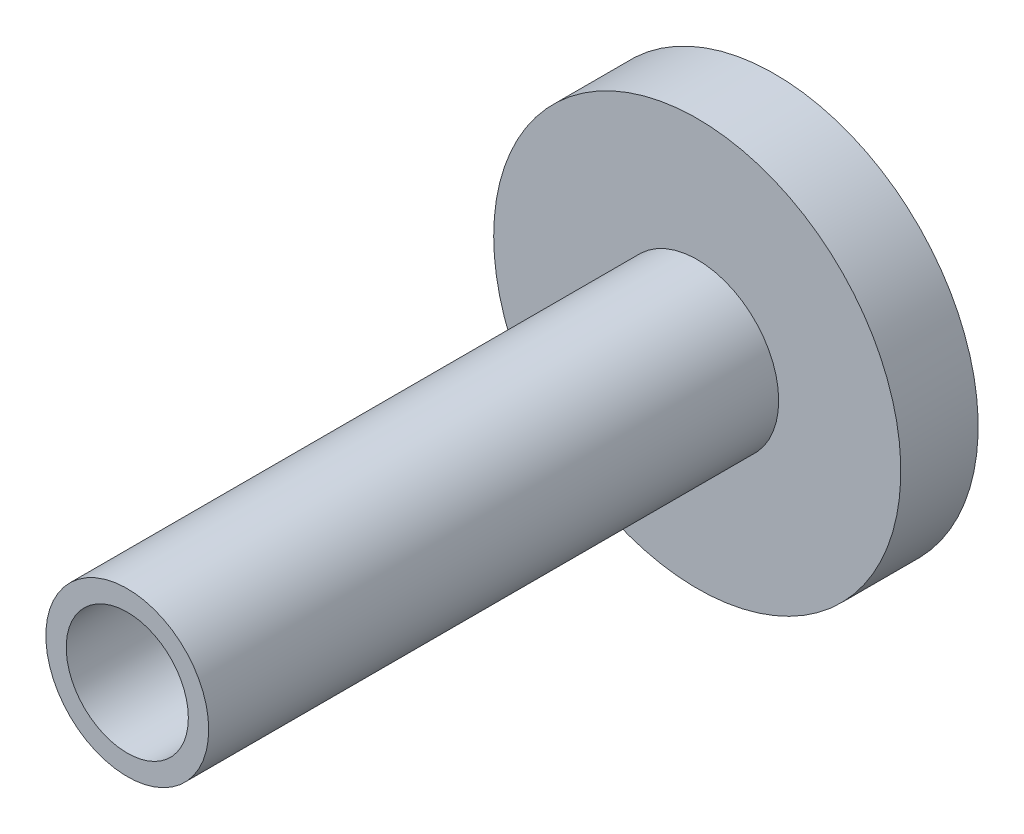
ISO-10303-21;
HEADER;
FILE_DESCRIPTION(('STEP AP214'),'2;1');
FILE_NAME('part.step','',(''),(''),'','','');
FILE_SCHEMA(('AUTOMOTIVE_DESIGN { 1 0 10303 214 1 1 1 1 }'));
ENDSEC;
DATA;
#1=APPLICATION_CONTEXT('core data for automotive mechanical design processes');
#2=APPLICATION_PROTOCOL_DEFINITION('international standard','automotive_design',2000,#1);
#3=PRODUCT_CONTEXT('',#1,'mechanical');
#4=PRODUCT('Part','Part','',(#3));
#5=PRODUCT_RELATED_PRODUCT_CATEGORY('part','',(#4));
#6=PRODUCT_DEFINITION_FORMATION('','',#4);
#7=PRODUCT_DEFINITION_CONTEXT('part definition',#1,'design');
#8=PRODUCT_DEFINITION('design','',#6,#7);
#9=PRODUCT_DEFINITION_SHAPE('','',#8);
#10=(LENGTH_UNIT() NAMED_UNIT(*) SI_UNIT(.MILLI.,.METRE.));
#11=(NAMED_UNIT(*) PLANE_ANGLE_UNIT() SI_UNIT($,.RADIAN.));
#12=(NAMED_UNIT(*) SI_UNIT($,.STERADIAN.) SOLID_ANGLE_UNIT());
#13=UNCERTAINTY_MEASURE_WITH_UNIT(LENGTH_MEASURE(1.E-05),#10,'distance_accuracy_value','');
#14=(GEOMETRIC_REPRESENTATION_CONTEXT(3) GLOBAL_UNCERTAINTY_ASSIGNED_CONTEXT((#13)) GLOBAL_UNIT_ASSIGNED_CONTEXT((#10,
#11,#12)) REPRESENTATION_CONTEXT('',''));
#15=CARTESIAN_POINT('',(0.,0.,0.));
#16=DIRECTION('',(0.,0.,1.));
#17=DIRECTION('',(1.,0.,0.));
#18=AXIS2_PLACEMENT_3D('',#15,#16,#17);
#19=CARTESIAN_POINT('',(0.,0.,1.9));
#20=DIRECTION('',(0.,0.,-1.));
#21=DIRECTION('',(-1.,0.,0.));
#22=AXIS2_PLACEMENT_3D('',#19,#20,#21);
#23=CYLINDRICAL_SURFACE('',#22,5.);
#24=CARTESIAN_POINT('',(0.,0.,1.9));
#25=DIRECTION('',(0.,0.,1.));
#26=DIRECTION('',(1.,0.,0.));
#27=AXIS2_PLACEMENT_3D('',#24,#25,#26);
#28=CIRCLE('',#27,5.);
#29=CARTESIAN_POINT('',(-5.,0.,1.9));
#30=VERTEX_POINT('',#29);
#31=EDGE_CURVE('E10',#30,#30,#28,.T.);
#32=CARTESIAN_POINT('',(0.,0.,0.));
#33=DIRECTION('',(0.,0.,1.));
#34=DIRECTION('',(1.,0.,0.));
#35=AXIS2_PLACEMENT_3D('',#32,#33,#34);
#36=CIRCLE('',#35,5.);
#37=CARTESIAN_POINT('',(-5.,0.,0.));
#38=VERTEX_POINT('',#37);
#39=EDGE_CURVE('E37',#38,#38,#36,.T.);
#40=CARTESIAN_POINT('',(-5.,0.,1.9));
#41=CARTESIAN_POINT('',(-5.,0.,1.88020833333333));
#42=CARTESIAN_POINT('',(-5.,0.,1.86041666666667));
#43=CARTESIAN_POINT('',(-5.,0.,1.82083333333333));
#44=CARTESIAN_POINT('',(-5.,0.,1.80104166666667));
#45=CARTESIAN_POINT('',(-5.,0.,1.76145833333333));
#46=CARTESIAN_POINT('',(-5.,0.,1.74166666666667));
#47=CARTESIAN_POINT('',(-5.,0.,1.70208333333333));
#48=CARTESIAN_POINT('',(-5.,0.,1.68229166666667));
#49=CARTESIAN_POINT('',(-5.,0.,1.64270833333333));
#50=CARTESIAN_POINT('',(-5.,0.,1.62291666666667));
#51=CARTESIAN_POINT('',(-5.,0.,1.58333333333333));
#52=CARTESIAN_POINT('',(-5.,0.,1.56354166666667));
#53=CARTESIAN_POINT('',(-5.,0.,1.52395833333333));
#54=CARTESIAN_POINT('',(-5.,0.,1.50416666666667));
#55=CARTESIAN_POINT('',(-5.,0.,1.46458333333333));
#56=CARTESIAN_POINT('',(-5.,0.,1.44479166666667));
#57=CARTESIAN_POINT('',(-5.,0.,1.40520833333333));
#58=CARTESIAN_POINT('',(-5.,0.,1.38541666666667));
#59=CARTESIAN_POINT('',(-5.,0.,1.34583333333333));
#60=CARTESIAN_POINT('',(-5.,0.,1.32604166666667));
#61=CARTESIAN_POINT('',(-5.,0.,1.28645833333333));
#62=CARTESIAN_POINT('',(-5.,0.,1.26666666666667));
#63=CARTESIAN_POINT('',(-5.,0.,1.22708333333333));
#64=CARTESIAN_POINT('',(-5.,0.,1.20729166666667));
#65=CARTESIAN_POINT('',(-5.,0.,1.16770833333333));
#66=CARTESIAN_POINT('',(-5.,0.,1.14791666666667));
#67=CARTESIAN_POINT('',(-5.,0.,1.10833333333333));
#68=CARTESIAN_POINT('',(-5.,0.,1.08854166666667));
#69=CARTESIAN_POINT('',(-5.,0.,1.04895833333333));
#70=CARTESIAN_POINT('',(-5.,0.,1.02916666666667));
#71=CARTESIAN_POINT('',(-5.,0.,0.989583333333333));
#72=CARTESIAN_POINT('',(-5.,0.,0.969791666666666));
#73=CARTESIAN_POINT('',(-5.,0.,0.930208333333333));
#74=CARTESIAN_POINT('',(-5.,0.,0.910416666666667));
#75=CARTESIAN_POINT('',(-5.,0.,0.870833333333333));
#76=CARTESIAN_POINT('',(-5.,0.,0.851041666666667));
#77=CARTESIAN_POINT('',(-5.,0.,0.811458333333333));
#78=CARTESIAN_POINT('',(-5.,0.,0.791666666666667));
#79=CARTESIAN_POINT('',(-5.,0.,0.752083333333333));
#80=CARTESIAN_POINT('',(-5.,0.,0.732291666666667));
#81=CARTESIAN_POINT('',(-5.,0.,0.692708333333333));
#82=CARTESIAN_POINT('',(-5.,0.,0.672916666666667));
#83=CARTESIAN_POINT('',(-5.,0.,0.633333333333333));
#84=CARTESIAN_POINT('',(-5.,0.,0.613541666666667));
#85=CARTESIAN_POINT('',(-5.,0.,0.573958333333333));
#86=CARTESIAN_POINT('',(-5.,0.,0.554166666666667));
#87=CARTESIAN_POINT('',(-5.,0.,0.514583333333334));
#88=CARTESIAN_POINT('',(-5.,0.,0.494791666666667));
#89=CARTESIAN_POINT('',(-5.,0.,0.455208333333333));
#90=CARTESIAN_POINT('',(-5.,0.,0.435416666666667));
#91=CARTESIAN_POINT('',(-5.,0.,0.395833333333333));
#92=CARTESIAN_POINT('',(-5.,0.,0.376041666666667));
#93=CARTESIAN_POINT('',(-5.,0.,0.336458333333333));
#94=CARTESIAN_POINT('',(-5.,0.,0.316666666666667));
#95=CARTESIAN_POINT('',(-5.,0.,0.277083333333333));
#96=CARTESIAN_POINT('',(-5.,0.,0.257291666666667));
#97=CARTESIAN_POINT('',(-5.,0.,0.217708333333333));
#98=CARTESIAN_POINT('',(-5.,0.,0.197916666666667));
#99=CARTESIAN_POINT('',(-5.,0.,0.158333333333333));
#100=CARTESIAN_POINT('',(-5.,0.,0.138541666666667));
#101=CARTESIAN_POINT('',(-5.,0.,0.0989583333333333));
#102=CARTESIAN_POINT('',(-5.,0.,0.0791666666666666));
#103=CARTESIAN_POINT('',(-5.,0.,0.0395833333333333));
#104=CARTESIAN_POINT('',(-5.,0.,0.0197916666666666));
#105=CARTESIAN_POINT('',(-5.,0.,0.));
#106=B_SPLINE_CURVE_WITH_KNOTS('',3,(#40,#41,#42,#43,#44,#45,#46,#47,#48,#49,#50,#51,#52,#53,
#54,#55,#56,#57,#58,#59,#60,#61,#62,#63,#64,#65,#66,#67,#68,#69,#70,#71,#72,#73,#74,#75,#76,#77,
#78,#79,#80,#81,#82,#83,#84,#85,#86,#87,#88,#89,#90,#91,#92,#93,#94,#95,#96,#97,#98,#99,#100,
#101,#102,#103,#104,#105),.UNSPECIFIED.,.F.,.F.,(4,2,2,2,2,2,2,2,2,2,2,2,2,2,2,2,2,2,2,2,2,2,2,
2,2,2,2,2,2,2,2,2,4),(0.,0.0593750000000002,0.11875,0.178125,0.2375,0.296875,0.35625,0.415625,
0.475,0.534375,0.59375,0.653125,0.7125,0.771875,0.83125,0.890625,0.95,1.009375,1.06875,1.128125,
1.1875,1.246875,1.30625,1.365625,1.425,1.484375,1.54375,1.603125,1.6625,1.721875,1.78125,
1.840625,1.9),.UNSPECIFIED.);
#107=EDGE_CURVE('BSEAM34',#30,#38,#106,.T.);
#108=ORIENTED_EDGE('',*,*,#31,.F.);
#109=ORIENTED_EDGE('',*,*,#39,.T.);
#110=ORIENTED_EDGE('',*,*,#107,.T.);
#111=ORIENTED_EDGE('',*,*,#107,.F.);
#112=EDGE_LOOP('',(#108,#110,#109,#111));
#113=FACE_BOUND('',#112,.T.);
#114=ADVANCED_FACE('F34',(#113),#23,.T.);
#115=CARTESIAN_POINT('',(0.,0.,1.9));
#116=DIRECTION('',(0.,0.,1.));
#117=DIRECTION('',(1.,0.,0.));
#118=AXIS2_PLACEMENT_3D('',#115,#116,#117);
#119=PLANE('',#118);
#120=CARTESIAN_POINT('',(0.,0.,1.9));
#121=DIRECTION('',(0.,0.,1.));
#122=DIRECTION('',(1.,0.,0.));
#123=AXIS2_PLACEMENT_3D('',#120,#121,#122);
#124=CIRCLE('',#123,2.);
#125=CARTESIAN_POINT('',(2.,0.,1.9));
#126=VERTEX_POINT('',#125);
#127=EDGE_CURVE('E46',#126,#126,#124,.T.);
#128=ORIENTED_EDGE('',*,*,#127,.F.);
#129=EDGE_LOOP('',(#128));
#130=FACE_BOUND('',#129,.T.);
#131=ORIENTED_EDGE('',*,*,#31,.T.);
#132=EDGE_LOOP('',(#131));
#133=FACE_BOUND('',#132,.T.);
#134=ADVANCED_FACE('F79',(#130,#133),#119,.T.);
#135=CARTESIAN_POINT('',(0.,0.,0.));
#136=DIRECTION('',(0.,0.,1.));
#137=DIRECTION('',(1.,0.,0.));
#138=AXIS2_PLACEMENT_3D('',#135,#136,#137);
#139=PLANE('',#138);
#140=ORIENTED_EDGE('',*,*,#39,.F.);
#141=EDGE_LOOP('',(#140));
#142=FACE_BOUND('',#141,.T.);
#143=ADVANCED_FACE('F75',(#142),#139,.F.);
#144=CARTESIAN_POINT('',(0.,0.,15.9));
#145=DIRECTION('',(0.,0.,-1.));
#146=DIRECTION('',(-1.,0.,0.));
#147=AXIS2_PLACEMENT_3D('',#144,#145,#146);
#148=CYLINDRICAL_SURFACE('',#147,2.);
#149=CARTESIAN_POINT('',(0.,0.,15.9));
#150=DIRECTION('',(0.,0.,1.));
#151=DIRECTION('',(1.,0.,0.));
#152=AXIS2_PLACEMENT_3D('',#149,#150,#151);
#153=CIRCLE('',#152,2.);
#154=CARTESIAN_POINT('',(2.,0.,15.9));
#155=VERTEX_POINT('',#154);
#156=EDGE_CURVE('E44',#155,#155,#153,.T.);
#157=ORIENTED_EDGE('',*,*,#156,.F.);
#158=EDGE_LOOP('',(#157));
#159=FACE_BOUND('',#158,.T.);
#160=ORIENTED_EDGE('',*,*,#127,.T.);
#161=EDGE_LOOP('',(#160));
#162=FACE_BOUND('',#161,.T.);
#163=ADVANCED_FACE('F69',(#159,#162),#148,.T.);
#164=CARTESIAN_POINT('',(0.,0.,15.9));
#165=DIRECTION('',(0.,0.,1.));
#166=DIRECTION('',(1.,0.,0.));
#167=AXIS2_PLACEMENT_3D('',#164,#165,#166);
#168=PLANE('',#167);
#169=CARTESIAN_POINT('',(0.,0.,15.9));
#170=DIRECTION('',(0.,0.,1.));
#171=DIRECTION('',(1.,0.,0.));
#172=AXIS2_PLACEMENT_3D('',#169,#170,#171);
#173=CIRCLE('',#172,1.5);
#174=CARTESIAN_POINT('',(1.5,0.,15.9));
#175=VERTEX_POINT('',#174);
#176=EDGE_CURVE('E52',#175,#175,#173,.T.);
#177=ORIENTED_EDGE('',*,*,#176,.F.);
#178=EDGE_LOOP('',(#177));
#179=FACE_BOUND('',#178,.T.);
#180=ORIENTED_EDGE('',*,*,#156,.T.);
#181=EDGE_LOOP('',(#180));
#182=FACE_BOUND('',#181,.T.);
#183=ADVANCED_FACE('F63',(#179,#182),#168,.T.);
#184=CARTESIAN_POINT('',(0.,0.,3.9));
#185=DIRECTION('',(0.,0.,1.));
#186=DIRECTION('',(1.,0.,0.));
#187=AXIS2_PLACEMENT_3D('',#184,#185,#186);
#188=CYLINDRICAL_SURFACE('',#187,1.5);
#189=CARTESIAN_POINT('',(0.,0.,3.9));
#190=DIRECTION('',(0.,0.,1.));
#191=DIRECTION('',(1.,0.,0.));
#192=AXIS2_PLACEMENT_3D('',#189,#190,#191);
#193=CIRCLE('',#192,1.5);
#194=CARTESIAN_POINT('',(1.5,0.,3.9));
#195=VERTEX_POINT('',#194);
#196=EDGE_CURVE('E49',#195,#195,#193,.T.);
#197=ORIENTED_EDGE('',*,*,#196,.F.);
#198=EDGE_LOOP('',(#197));
#199=FACE_BOUND('',#198,.T.);
#200=ORIENTED_EDGE('',*,*,#176,.T.);
#201=EDGE_LOOP('',(#200));
#202=FACE_BOUND('',#201,.T.);
#203=ADVANCED_FACE('F60',(#199,#202),#188,.F.);
#204=CARTESIAN_POINT('',(0.,0.,3.9));
#205=DIRECTION('',(0.,0.,1.));
#206=DIRECTION('',(1.,0.,0.));
#207=AXIS2_PLACEMENT_3D('',#204,#205,#206);
#208=PLANE('',#207);
#209=ORIENTED_EDGE('',*,*,#196,.T.);
#210=EDGE_LOOP('',(#209));
#211=FACE_BOUND('',#210,.T.);
#212=ADVANCED_FACE('F58',(#211),#208,.T.);
#213=CLOSED_SHELL('',(#114,#134,#143,#163,#183,#203,#212));
#214=MANIFOLD_SOLID_BREP('B2',#213);
#215=ADVANCED_BREP_SHAPE_REPRESENTATION('',(#18,#214),#14);
#216=SHAPE_DEFINITION_REPRESENTATION(#9,#215);
ENDSEC;
END-ISO-10303-21;
